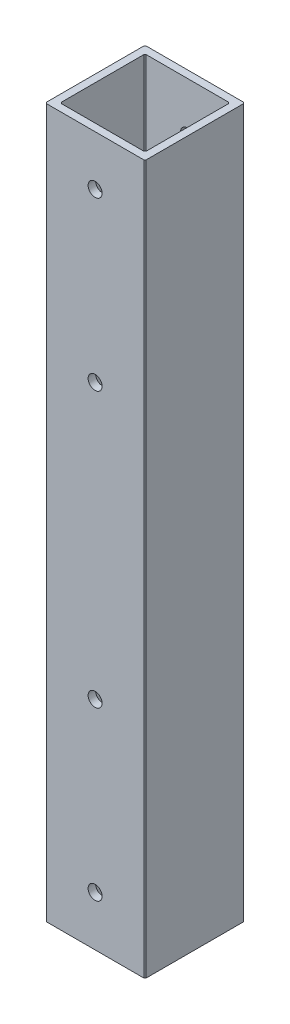
ISO-10303-21;
HEADER;
FILE_DESCRIPTION(('STEP AP214'),'2;1');
FILE_NAME('part.step','',(''),(''),'','','');
FILE_SCHEMA(('AUTOMOTIVE_DESIGN { 1 0 10303 214 1 1 1 1 }'));
ENDSEC;
DATA;
#1=APPLICATION_CONTEXT('core data for automotive mechanical design processes');
#2=APPLICATION_PROTOCOL_DEFINITION('international standard','automotive_design',2000,#1);
#3=PRODUCT_CONTEXT('',#1,'mechanical');
#4=PRODUCT('Part','Part','',(#3));
#5=PRODUCT_RELATED_PRODUCT_CATEGORY('part','',(#4));
#6=PRODUCT_DEFINITION_FORMATION('','',#4);
#7=PRODUCT_DEFINITION_CONTEXT('part definition',#1,'design');
#8=PRODUCT_DEFINITION('design','',#6,#7);
#9=PRODUCT_DEFINITION_SHAPE('','',#8);
#10=(LENGTH_UNIT() NAMED_UNIT(*) SI_UNIT(.MILLI.,.METRE.));
#11=(NAMED_UNIT(*) PLANE_ANGLE_UNIT() SI_UNIT($,.RADIAN.));
#12=(NAMED_UNIT(*) SI_UNIT($,.STERADIAN.) SOLID_ANGLE_UNIT());
#13=UNCERTAINTY_MEASURE_WITH_UNIT(LENGTH_MEASURE(1.E-05),#10,'distance_accuracy_value','');
#14=(GEOMETRIC_REPRESENTATION_CONTEXT(3) GLOBAL_UNCERTAINTY_ASSIGNED_CONTEXT((#13)) GLOBAL_UNIT_ASSIGNED_CONTEXT((#10,
#11,#12)) REPRESENTATION_CONTEXT('',''));
#15=CARTESIAN_POINT('',(0.,0.,0.));
#16=DIRECTION('',(0.,0.,1.));
#17=DIRECTION('',(1.,0.,0.));
#18=AXIS2_PLACEMENT_3D('',#15,#16,#17);
#19=CARTESIAN_POINT('',(-170.,-142.,180.));
#20=DIRECTION('',(0.,0.,1.));
#21=DIRECTION('',(1.,0.,0.));
#22=AXIS2_PLACEMENT_3D('',#19,#20,#21);
#23=PLANE('',#22);
#24=CARTESIAN_POINT('',(-190.,122.,180.));
#25=DIRECTION('',(0.,0.,-1.));
#26=DIRECTION('',(-1.,0.,0.));
#27=AXIS2_PLACEMENT_3D('',#24,#25,#26);
#28=CIRCLE('',#27,2.8);
#29=CARTESIAN_POINT('',(-192.8,122.,180.));
#30=VERTEX_POINT('',#29);
#31=EDGE_CURVE('E530',#30,#30,#28,.T.);
#32=ORIENTED_EDGE('',*,*,#31,.T.);
#33=EDGE_LOOP('',(#32));
#34=FACE_BOUND('',#33,.T.);
#35=CARTESIAN_POINT('',(-190.,55.,180.));
#36=DIRECTION('',(0.,0.,-1.));
#37=DIRECTION('',(-1.,0.,0.));
#38=AXIS2_PLACEMENT_3D('',#35,#36,#37);
#39=CIRCLE('',#38,2.8);
#40=CARTESIAN_POINT('',(-192.8,55.,180.));
#41=VERTEX_POINT('',#40);
#42=EDGE_CURVE('E522',#41,#41,#39,.T.);
#43=ORIENTED_EDGE('',*,*,#42,.T.);
#44=EDGE_LOOP('',(#43));
#45=FACE_BOUND('',#44,.T.);
#46=CARTESIAN_POINT('',(-190.,-55.,180.));
#47=DIRECTION('',(0.,0.,-1.));
#48=DIRECTION('',(-1.,0.,0.));
#49=AXIS2_PLACEMENT_3D('',#46,#47,#48);
#50=CIRCLE('',#49,2.8);
#51=CARTESIAN_POINT('',(-192.8,-55.,180.));
#52=VERTEX_POINT('',#51);
#53=EDGE_CURVE('E514',#52,#52,#50,.T.);
#54=ORIENTED_EDGE('',*,*,#53,.T.);
#55=EDGE_LOOP('',(#54));
#56=FACE_BOUND('',#55,.T.);
#57=CARTESIAN_POINT('',(-190.,-122.,180.));
#58=DIRECTION('',(0.,0.,-1.));
#59=DIRECTION('',(-1.,0.,0.));
#60=AXIS2_PLACEMENT_3D('',#57,#58,#59);
#61=CIRCLE('',#60,2.8);
#62=CARTESIAN_POINT('',(-192.8,-122.,180.));
#63=VERTEX_POINT('',#62);
#64=EDGE_CURVE('E506',#63,#63,#61,.T.);
#65=ORIENTED_EDGE('',*,*,#64,.T.);
#66=EDGE_LOOP('',(#65));
#67=FACE_BOUND('',#66,.T.);
#68=DIRECTION('',(-1.,0.,0.));
#69=VECTOR('',#68,1.);
#70=CARTESIAN_POINT('',(-170.,142.,180.));
#71=LINE('',#70,#69);
#72=CARTESIAN_POINT('',(-170.5,142.,180.));
#73=VERTEX_POINT('',#72);
#74=CARTESIAN_POINT('',(-209.5,142.,180.));
#75=VERTEX_POINT('',#74);
#76=EDGE_CURVE('E185',#73,#75,#71,.T.);
#77=ORIENTED_EDGE('',*,*,#76,.T.);
#78=DIRECTION('',(0.,-1.,0.));
#79=VECTOR('',#78,1.);
#80=CARTESIAN_POINT('',(-209.5,-142.,180.));
#81=LINE('',#80,#79);
#82=CARTESIAN_POINT('',(-209.5,-142.,180.));
#83=VERTEX_POINT('',#82);
#84=EDGE_CURVE('E229',#75,#83,#81,.T.);
#85=ORIENTED_EDGE('',*,*,#84,.T.);
#86=DIRECTION('',(-1.,0.,0.));
#87=VECTOR('',#86,1.);
#88=CARTESIAN_POINT('',(-170.,-142.,180.));
#89=LINE('',#88,#87);
#90=CARTESIAN_POINT('',(-170.5,-142.,180.));
#91=VERTEX_POINT('',#90);
#92=EDGE_CURVE('E196',#91,#83,#89,.T.);
#93=ORIENTED_EDGE('',*,*,#92,.F.);
#94=DIRECTION('',(0.,1.,0.));
#95=VECTOR('',#94,1.);
#96=CARTESIAN_POINT('',(-170.5,142.,180.));
#97=LINE('',#96,#95);
#98=EDGE_CURVE('E226',#91,#73,#97,.T.);
#99=ORIENTED_EDGE('',*,*,#98,.T.);
#100=EDGE_LOOP('',(#77,#85,#93,#99));
#101=FACE_BOUND('',#100,.T.);
#102=ADVANCED_FACE('F45',(#34,#45,#56,#67,#101),#23,.T.);
#103=CARTESIAN_POINT('',(-170.,-142.,140.));
#104=DIRECTION('',(0.,-1.,0.));
#105=DIRECTION('',(1.,0.,0.));
#106=AXIS2_PLACEMENT_3D('',#103,#104,#105);
#107=PLANE('',#106);
#108=DIRECTION('',(1.,0.,0.));
#109=VECTOR('',#108,1.);
#110=CARTESIAN_POINT('',(-207.,-142.,143.));
#111=LINE('',#110,#109);
#112=CARTESIAN_POINT('',(-206.5,-142.,143.));
#113=VERTEX_POINT('',#112);
#114=CARTESIAN_POINT('',(-173.5,-142.,143.));
#115=VERTEX_POINT('',#114);
#116=EDGE_CURVE('E286',#113,#115,#111,.T.);
#117=ORIENTED_EDGE('',*,*,#116,.F.);
#118=DIRECTION('',(0.707106781186548,0.,-0.707106781186548));
#119=VECTOR('',#118,1.);
#120=CARTESIAN_POINT('',(-206.5,-142.,143.));
#121=LINE('',#120,#119);
#122=CARTESIAN_POINT('',(-207.,-142.,143.5));
#123=VERTEX_POINT('',#122);
#124=EDGE_CURVE('E55',#113,#123,#121,.F.);
#125=ORIENTED_EDGE('',*,*,#124,.T.);
#126=DIRECTION('',(0.,0.,-1.));
#127=VECTOR('',#126,1.);
#128=CARTESIAN_POINT('',(-207.,-142.,177.));
#129=LINE('',#128,#127);
#130=CARTESIAN_POINT('',(-207.,-142.,176.5));
#131=VERTEX_POINT('',#130);
#132=EDGE_CURVE('E284',#131,#123,#129,.T.);
#133=ORIENTED_EDGE('',*,*,#132,.F.);
#134=DIRECTION('',(-0.707106781186548,0.,-0.707106781186548));
#135=VECTOR('',#134,1.);
#136=CARTESIAN_POINT('',(-207.,-142.,176.5));
#137=LINE('',#136,#135);
#138=CARTESIAN_POINT('',(-206.5,-142.,177.));
#139=VERTEX_POINT('',#138);
#140=EDGE_CURVE('E260',#131,#139,#137,.F.);
#141=ORIENTED_EDGE('',*,*,#140,.T.);
#142=DIRECTION('',(-1.,0.,0.));
#143=VECTOR('',#142,1.);
#144=CARTESIAN_POINT('',(-173.,-142.,177.));
#145=LINE('',#144,#143);
#146=CARTESIAN_POINT('',(-173.5,-142.,177.));
#147=VERTEX_POINT('',#146);
#148=EDGE_CURVE('E297',#147,#139,#145,.T.);
#149=ORIENTED_EDGE('',*,*,#148,.F.);
#150=DIRECTION('',(-0.707106781186548,0.,0.707106781186548));
#151=VECTOR('',#150,1.);
#152=CARTESIAN_POINT('',(-173.5,-142.,177.));
#153=LINE('',#152,#151);
#154=CARTESIAN_POINT('',(-173.,-142.,176.5));
#155=VERTEX_POINT('',#154);
#156=EDGE_CURVE('E272',#147,#155,#153,.F.);
#157=ORIENTED_EDGE('',*,*,#156,.T.);
#158=DIRECTION('',(0.,0.,1.));
#159=VECTOR('',#158,1.);
#160=CARTESIAN_POINT('',(-173.,-142.,143.));
#161=LINE('',#160,#159);
#162=CARTESIAN_POINT('',(-173.,-142.,143.5));
#163=VERTEX_POINT('',#162);
#164=EDGE_CURVE('E327',#163,#155,#161,.T.);
#165=ORIENTED_EDGE('',*,*,#164,.F.);
#166=DIRECTION('',(0.707106781186548,0.,0.707106781186548));
#167=VECTOR('',#166,1.);
#168=CARTESIAN_POINT('',(-173.,-142.,143.5));
#169=LINE('',#168,#167);
#170=EDGE_CURVE('E266',#163,#115,#169,.F.);
#171=ORIENTED_EDGE('',*,*,#170,.T.);
#172=EDGE_LOOP('',(#117,#125,#133,#141,#149,#157,#165,#171));
#173=FACE_BOUND('',#172,.T.);
#174=DIRECTION('',(-1.,0.,0.));
#175=VECTOR('',#174,1.);
#176=CARTESIAN_POINT('',(-170.,-142.,140.));
#177=LINE('',#176,#175);
#178=CARTESIAN_POINT('',(-170.5,-142.,140.));
#179=VERTEX_POINT('',#178);
#180=CARTESIAN_POINT('',(-209.5,-142.,140.));
#181=VERTEX_POINT('',#180);
#182=EDGE_CURVE('E184',#179,#181,#177,.T.);
#183=ORIENTED_EDGE('',*,*,#182,.F.);
#184=DIRECTION('',(0.707106781186548,0.,0.707106781186548));
#185=VECTOR('',#184,1.);
#186=CARTESIAN_POINT('',(-170.25,-142.,140.25));
#187=LINE('',#186,#185);
#188=CARTESIAN_POINT('',(-170.,-142.,140.5));
#189=VERTEX_POINT('',#188);
#190=EDGE_CURVE('E188',#179,#189,#187,.T.);
#191=ORIENTED_EDGE('',*,*,#190,.T.);
#192=DIRECTION('',(0.,0.,1.));
#193=VECTOR('',#192,1.);
#194=CARTESIAN_POINT('',(-170.,-142.,140.));
#195=LINE('',#194,#193);
#196=CARTESIAN_POINT('',(-170.,-142.,179.5));
#197=VERTEX_POINT('',#196);
#198=EDGE_CURVE('E336',#189,#197,#195,.T.);
#199=ORIENTED_EDGE('',*,*,#198,.T.);
#200=DIRECTION('',(-0.707106781186548,0.,0.707106781186548));
#201=VECTOR('',#200,1.);
#202=CARTESIAN_POINT('',(-150.25,-142.,159.75));
#203=LINE('',#202,#201);
#204=EDGE_CURVE('E190',#197,#91,#203,.T.);
#205=ORIENTED_EDGE('',*,*,#204,.T.);
#206=ORIENTED_EDGE('',*,*,#92,.T.);
#207=DIRECTION('',(0.707106781186548,0.,0.707106781186548));
#208=VECTOR('',#207,1.);
#209=CARTESIAN_POINT('',(-209.75,-142.,179.75));
#210=LINE('',#209,#208);
#211=CARTESIAN_POINT('',(-210.,-142.,179.5));
#212=VERTEX_POINT('',#211);
#213=EDGE_CURVE('E194',#83,#212,#210,.F.);
#214=ORIENTED_EDGE('',*,*,#213,.T.);
#215=DIRECTION('',(0.,0.,1.));
#216=VECTOR('',#215,1.);
#217=CARTESIAN_POINT('',(-210.,-142.,140.));
#218=LINE('',#217,#216);
#219=CARTESIAN_POINT('',(-210.,-142.,140.5));
#220=VERTEX_POINT('',#219);
#221=EDGE_CURVE('E337',#220,#212,#218,.T.);
#222=ORIENTED_EDGE('',*,*,#221,.F.);
#223=DIRECTION('',(-0.707106781186548,0.,0.707106781186548));
#224=VECTOR('',#223,1.);
#225=CARTESIAN_POINT('',(-189.75,-142.,120.25));
#226=LINE('',#225,#224);
#227=EDGE_CURVE('E202',#220,#181,#226,.F.);
#228=ORIENTED_EDGE('',*,*,#227,.T.);
#229=EDGE_LOOP('',(#183,#191,#199,#205,#206,#214,#222,#228));
#230=FACE_BOUND('',#229,.T.);
#231=ADVANCED_FACE('F282',(#173,#230),#107,.T.);
#232=CARTESIAN_POINT('',(-170.,142.,140.));
#233=DIRECTION('',(0.,0.,-1.));
#234=DIRECTION('',(-1.,0.,0.));
#235=AXIS2_PLACEMENT_3D('',#232,#233,#234);
#236=PLANE('',#235);
#237=CARTESIAN_POINT('',(-190.,122.,140.));
#238=DIRECTION('',(0.,0.,-1.));
#239=DIRECTION('',(-1.,0.,0.));
#240=AXIS2_PLACEMENT_3D('',#237,#238,#239);
#241=CIRCLE('',#240,2.8);
#242=CARTESIAN_POINT('',(-192.8,122.,140.));
#243=VERTEX_POINT('',#242);
#244=EDGE_CURVE('E471',#243,#243,#241,.T.);
#245=ORIENTED_EDGE('',*,*,#244,.F.);
#246=EDGE_LOOP('',(#245));
#247=FACE_BOUND('',#246,.T.);
#248=CARTESIAN_POINT('',(-190.,55.,140.));
#249=DIRECTION('',(0.,0.,-1.));
#250=DIRECTION('',(-1.,0.,0.));
#251=AXIS2_PLACEMENT_3D('',#248,#249,#250);
#252=CIRCLE('',#251,2.8);
#253=CARTESIAN_POINT('',(-192.8,55.,140.));
#254=VERTEX_POINT('',#253);
#255=EDGE_CURVE('E475',#254,#254,#252,.T.);
#256=ORIENTED_EDGE('',*,*,#255,.F.);
#257=EDGE_LOOP('',(#256));
#258=FACE_BOUND('',#257,.T.);
#259=CARTESIAN_POINT('',(-190.,-55.,140.));
#260=DIRECTION('',(0.,0.,-1.));
#261=DIRECTION('',(-1.,0.,0.));
#262=AXIS2_PLACEMENT_3D('',#259,#260,#261);
#263=CIRCLE('',#262,2.8);
#264=CARTESIAN_POINT('',(-192.8,-55.,140.));
#265=VERTEX_POINT('',#264);
#266=EDGE_CURVE('E479',#265,#265,#263,.T.);
#267=ORIENTED_EDGE('',*,*,#266,.F.);
#268=EDGE_LOOP('',(#267));
#269=FACE_BOUND('',#268,.T.);
#270=CARTESIAN_POINT('',(-190.,-122.,140.));
#271=DIRECTION('',(0.,0.,-1.));
#272=DIRECTION('',(-1.,0.,0.));
#273=AXIS2_PLACEMENT_3D('',#270,#271,#272);
#274=CIRCLE('',#273,2.8);
#275=CARTESIAN_POINT('',(-192.8,-122.,140.));
#276=VERTEX_POINT('',#275);
#277=EDGE_CURVE('E482',#276,#276,#274,.T.);
#278=ORIENTED_EDGE('',*,*,#277,.F.);
#279=EDGE_LOOP('',(#278));
#280=FACE_BOUND('',#279,.T.);
#281=DIRECTION('',(-1.,0.,0.));
#282=VECTOR('',#281,1.);
#283=CARTESIAN_POINT('',(-170.,142.,140.));
#284=LINE('',#283,#282);
#285=CARTESIAN_POINT('',(-170.5,142.,140.));
#286=VERTEX_POINT('',#285);
#287=CARTESIAN_POINT('',(-209.5,142.,140.));
#288=VERTEX_POINT('',#287);
#289=EDGE_CURVE('E164',#286,#288,#284,.T.);
#290=ORIENTED_EDGE('',*,*,#289,.F.);
#291=DIRECTION('',(0.,-1.,0.));
#292=VECTOR('',#291,1.);
#293=CARTESIAN_POINT('',(-170.5,-142.,140.));
#294=LINE('',#293,#292);
#295=EDGE_CURVE('E179',#286,#179,#294,.T.);
#296=ORIENTED_EDGE('',*,*,#295,.T.);
#297=ORIENTED_EDGE('',*,*,#182,.T.);
#298=DIRECTION('',(0.,1.,0.));
#299=VECTOR('',#298,1.);
#300=CARTESIAN_POINT('',(-209.5,142.,140.));
#301=LINE('',#300,#299);
#302=EDGE_CURVE('E182',#181,#288,#301,.T.);
#303=ORIENTED_EDGE('',*,*,#302,.T.);
#304=EDGE_LOOP('',(#290,#296,#297,#303));
#305=FACE_BOUND('',#304,.T.);
#306=ADVANCED_FACE('F177',(#247,#258,#269,#280,#305),#236,.T.);
#307=CARTESIAN_POINT('',(-170.,142.,180.));
#308=DIRECTION('',(0.,1.,0.));
#309=DIRECTION('',(-1.,0.,0.));
#310=AXIS2_PLACEMENT_3D('',#307,#308,#309);
#311=PLANE('',#310);
#312=DIRECTION('',(0.,0.,-1.));
#313=VECTOR('',#312,1.);
#314=CARTESIAN_POINT('',(-207.,142.,177.));
#315=LINE('',#314,#313);
#316=CARTESIAN_POINT('',(-207.,142.,176.5));
#317=VERTEX_POINT('',#316);
#318=CARTESIAN_POINT('',(-207.,142.,143.5));
#319=VERTEX_POINT('',#318);
#320=EDGE_CURVE('E304',#317,#319,#315,.T.);
#321=ORIENTED_EDGE('',*,*,#320,.T.);
#322=DIRECTION('',(-0.707106781186548,0.,0.707106781186548));
#323=VECTOR('',#322,1.);
#324=CARTESIAN_POINT('',(-206.5,142.,143.));
#325=LINE('',#324,#323);
#326=CARTESIAN_POINT('',(-206.5,142.,143.));
#327=VERTEX_POINT('',#326);
#328=EDGE_CURVE('E11',#319,#327,#325,.F.);
#329=ORIENTED_EDGE('',*,*,#328,.T.);
#330=DIRECTION('',(1.,0.,0.));
#331=VECTOR('',#330,1.);
#332=CARTESIAN_POINT('',(-207.,142.,143.));
#333=LINE('',#332,#331);
#334=CARTESIAN_POINT('',(-173.5,142.,143.));
#335=VERTEX_POINT('',#334);
#336=EDGE_CURVE('E296',#327,#335,#333,.T.);
#337=ORIENTED_EDGE('',*,*,#336,.T.);
#338=DIRECTION('',(-0.707106781186548,0.,-0.707106781186548));
#339=VECTOR('',#338,1.);
#340=CARTESIAN_POINT('',(-173.,142.,143.5));
#341=LINE('',#340,#339);
#342=CARTESIAN_POINT('',(-173.,142.,143.5));
#343=VERTEX_POINT('',#342);
#344=EDGE_CURVE('E269',#335,#343,#341,.F.);
#345=ORIENTED_EDGE('',*,*,#344,.T.);
#346=DIRECTION('',(0.,0.,1.));
#347=VECTOR('',#346,1.);
#348=CARTESIAN_POINT('',(-173.,142.,143.));
#349=LINE('',#348,#347);
#350=CARTESIAN_POINT('',(-173.,142.,176.5));
#351=VERTEX_POINT('',#350);
#352=EDGE_CURVE('E309',#343,#351,#349,.T.);
#353=ORIENTED_EDGE('',*,*,#352,.T.);
#354=DIRECTION('',(0.707106781186548,0.,-0.707106781186548));
#355=VECTOR('',#354,1.);
#356=CARTESIAN_POINT('',(-173.5,142.,177.));
#357=LINE('',#356,#355);
#358=CARTESIAN_POINT('',(-173.5,142.,177.));
#359=VERTEX_POINT('',#358);
#360=EDGE_CURVE('E275',#351,#359,#357,.F.);
#361=ORIENTED_EDGE('',*,*,#360,.T.);
#362=DIRECTION('',(-1.,0.,0.));
#363=VECTOR('',#362,1.);
#364=CARTESIAN_POINT('',(-173.,142.,177.));
#365=LINE('',#364,#363);
#366=CARTESIAN_POINT('',(-206.5,142.,177.));
#367=VERTEX_POINT('',#366);
#368=EDGE_CURVE('E313',#359,#367,#365,.T.);
#369=ORIENTED_EDGE('',*,*,#368,.T.);
#370=DIRECTION('',(0.707106781186548,0.,0.707106781186548));
#371=VECTOR('',#370,1.);
#372=CARTESIAN_POINT('',(-207.,142.,176.5));
#373=LINE('',#372,#371);
#374=EDGE_CURVE('E263',#367,#317,#373,.F.);
#375=ORIENTED_EDGE('',*,*,#374,.T.);
#376=EDGE_LOOP('',(#321,#329,#337,#345,#353,#361,#369,#375));
#377=FACE_BOUND('',#376,.T.);
#378=DIRECTION('',(0.,0.,-1.));
#379=VECTOR('',#378,1.);
#380=CARTESIAN_POINT('',(-170.,142.,180.));
#381=LINE('',#380,#379);
#382=CARTESIAN_POINT('',(-170.,142.,179.5));
#383=VERTEX_POINT('',#382);
#384=CARTESIAN_POINT('',(-170.,142.,140.5));
#385=VERTEX_POINT('',#384);
#386=EDGE_CURVE('E167',#383,#385,#381,.T.);
#387=ORIENTED_EDGE('',*,*,#386,.T.);
#388=DIRECTION('',(-0.707106781186548,0.,-0.707106781186548));
#389=VECTOR('',#388,1.);
#390=CARTESIAN_POINT('',(-150.25,142.,160.25));
#391=LINE('',#390,#389);
#392=EDGE_CURVE('E161',#385,#286,#391,.T.);
#393=ORIENTED_EDGE('',*,*,#392,.T.);
#394=ORIENTED_EDGE('',*,*,#289,.T.);
#395=DIRECTION('',(0.707106781186548,0.,-0.707106781186548));
#396=VECTOR('',#395,1.);
#397=CARTESIAN_POINT('',(-209.75,142.,140.25));
#398=LINE('',#397,#396);
#399=CARTESIAN_POINT('',(-210.,142.,140.5));
#400=VERTEX_POINT('',#399);
#401=EDGE_CURVE('E173',#288,#400,#398,.F.);
#402=ORIENTED_EDGE('',*,*,#401,.T.);
#403=DIRECTION('',(0.,0.,-1.));
#404=VECTOR('',#403,1.);
#405=CARTESIAN_POINT('',(-210.,142.,180.));
#406=LINE('',#405,#404);
#407=CARTESIAN_POINT('',(-210.,142.,179.5));
#408=VERTEX_POINT('',#407);
#409=EDGE_CURVE('E324',#408,#400,#406,.T.);
#410=ORIENTED_EDGE('',*,*,#409,.F.);
#411=DIRECTION('',(-0.707106781186548,0.,-0.707106781186548));
#412=VECTOR('',#411,1.);
#413=CARTESIAN_POINT('',(-189.75,142.,199.75));
#414=LINE('',#413,#412);
#415=EDGE_CURVE('E62',#408,#75,#414,.F.);
#416=ORIENTED_EDGE('',*,*,#415,.T.);
#417=ORIENTED_EDGE('',*,*,#76,.F.);
#418=DIRECTION('',(0.707106781186548,0.,-0.707106781186548));
#419=VECTOR('',#418,1.);
#420=CARTESIAN_POINT('',(-170.25,142.,179.75));
#421=LINE('',#420,#419);
#422=EDGE_CURVE('E70',#73,#383,#421,.T.);
#423=ORIENTED_EDGE('',*,*,#422,.T.);
#424=EDGE_LOOP('',(#387,#393,#394,#402,#410,#416,#417,#423));
#425=FACE_BOUND('',#424,.T.);
#426=ADVANCED_FACE('F163',(#377,#425),#311,.T.);
#427=CARTESIAN_POINT('',(-170.,0.,0.));
#428=DIRECTION('',(-1.,0.,0.));
#429=DIRECTION('',(0.,-1.,0.));
#430=AXIS2_PLACEMENT_3D('',#427,#428,#429);
#431=PLANE('',#430);
#432=ORIENTED_EDGE('',*,*,#198,.F.);
#433=DIRECTION('',(0.,1.,0.));
#434=VECTOR('',#433,1.);
#435=CARTESIAN_POINT('',(-170.,142.,140.5));
#436=LINE('',#435,#434);
#437=EDGE_CURVE('E210',#189,#385,#436,.T.);
#438=ORIENTED_EDGE('',*,*,#437,.T.);
#439=ORIENTED_EDGE('',*,*,#386,.F.);
#440=DIRECTION('',(0.,-1.,0.));
#441=VECTOR('',#440,1.);
#442=CARTESIAN_POINT('',(-170.,-142.,179.5));
#443=LINE('',#442,#441);
#444=EDGE_CURVE('E207',#383,#197,#443,.T.);
#445=ORIENTED_EDGE('',*,*,#444,.T.);
#446=EDGE_LOOP('',(#432,#438,#439,#445));
#447=FACE_BOUND('',#446,.T.);
#448=ADVANCED_FACE('F368',(#447),#431,.F.);
#449=CARTESIAN_POINT('',(-210.,0.,0.));
#450=DIRECTION('',(-1.,0.,0.));
#451=DIRECTION('',(0.,-1.,0.));
#452=AXIS2_PLACEMENT_3D('',#449,#450,#451);
#453=PLANE('',#452);
#454=ORIENTED_EDGE('',*,*,#409,.T.);
#455=DIRECTION('',(0.,-1.,0.));
#456=VECTOR('',#455,1.);
#457=CARTESIAN_POINT('',(-210.,0.,140.5));
#458=LINE('',#457,#456);
#459=EDGE_CURVE('E222',#400,#220,#458,.T.);
#460=ORIENTED_EDGE('',*,*,#459,.T.);
#461=ORIENTED_EDGE('',*,*,#221,.T.);
#462=DIRECTION('',(0.,1.,0.));
#463=VECTOR('',#462,1.);
#464=CARTESIAN_POINT('',(-210.,0.,179.5));
#465=LINE('',#464,#463);
#466=EDGE_CURVE('E172',#212,#408,#465,.T.);
#467=ORIENTED_EDGE('',*,*,#466,.T.);
#468=EDGE_LOOP('',(#454,#460,#461,#467));
#469=FACE_BOUND('',#468,.T.);
#470=ADVANCED_FACE('F361',(#469),#453,.T.);
#471=CARTESIAN_POINT('',(-207.,142.,143.));
#472=DIRECTION('',(0.,0.,-1.));
#473=DIRECTION('',(-1.,0.,0.));
#474=AXIS2_PLACEMENT_3D('',#471,#472,#473);
#475=PLANE('',#474);
#476=CARTESIAN_POINT('',(-190.,122.,143.));
#477=DIRECTION('',(0.,0.,-1.));
#478=DIRECTION('',(-1.,0.,0.));
#479=AXIS2_PLACEMENT_3D('',#476,#477,#478);
#480=CIRCLE('',#479,2.8);
#481=CARTESIAN_POINT('',(-192.8,122.,143.));
#482=VERTEX_POINT('',#481);
#483=EDGE_CURVE('E500',#482,#482,#480,.T.);
#484=ORIENTED_EDGE('',*,*,#483,.T.);
#485=EDGE_LOOP('',(#484));
#486=FACE_BOUND('',#485,.T.);
#487=CARTESIAN_POINT('',(-190.,55.,143.));
#488=DIRECTION('',(0.,0.,-1.));
#489=DIRECTION('',(-1.,0.,0.));
#490=AXIS2_PLACEMENT_3D('',#487,#488,#489);
#491=CIRCLE('',#490,2.8);
#492=CARTESIAN_POINT('',(-192.8,55.,143.));
#493=VERTEX_POINT('',#492);
#494=EDGE_CURVE('E494',#493,#493,#491,.T.);
#495=ORIENTED_EDGE('',*,*,#494,.T.);
#496=EDGE_LOOP('',(#495));
#497=FACE_BOUND('',#496,.T.);
#498=CARTESIAN_POINT('',(-190.,-55.,143.));
#499=DIRECTION('',(0.,0.,-1.));
#500=DIRECTION('',(-1.,0.,0.));
#501=AXIS2_PLACEMENT_3D('',#498,#499,#500);
#502=CIRCLE('',#501,2.8);
#503=CARTESIAN_POINT('',(-192.8,-55.,143.));
#504=VERTEX_POINT('',#503);
#505=EDGE_CURVE('E485',#504,#504,#502,.T.);
#506=ORIENTED_EDGE('',*,*,#505,.T.);
#507=EDGE_LOOP('',(#506));
#508=FACE_BOUND('',#507,.T.);
#509=CARTESIAN_POINT('',(-190.,-122.,143.));
#510=DIRECTION('',(0.,0.,-1.));
#511=DIRECTION('',(-1.,0.,0.));
#512=AXIS2_PLACEMENT_3D('',#509,#510,#511);
#513=CIRCLE('',#512,2.8);
#514=CARTESIAN_POINT('',(-192.8,-122.,143.));
#515=VERTEX_POINT('',#514);
#516=EDGE_CURVE('E316',#515,#515,#513,.T.);
#517=ORIENTED_EDGE('',*,*,#516,.T.);
#518=EDGE_LOOP('',(#517));
#519=FACE_BOUND('',#518,.T.);
#520=ORIENTED_EDGE('',*,*,#116,.T.);
#521=DIRECTION('',(0.,1.,0.));
#522=VECTOR('',#521,1.);
#523=CARTESIAN_POINT('',(-173.5,142.,143.));
#524=LINE('',#523,#522);
#525=EDGE_CURVE('E257',#115,#335,#524,.T.);
#526=ORIENTED_EDGE('',*,*,#525,.T.);
#527=ORIENTED_EDGE('',*,*,#336,.F.);
#528=DIRECTION('',(0.,-1.,0.));
#529=VECTOR('',#528,1.);
#530=CARTESIAN_POINT('',(-206.5,-142.,143.));
#531=LINE('',#530,#529);
#532=EDGE_CURVE('E253',#327,#113,#531,.T.);
#533=ORIENTED_EDGE('',*,*,#532,.T.);
#534=EDGE_LOOP('',(#520,#526,#527,#533));
#535=FACE_BOUND('',#534,.T.);
#536=ADVANCED_FACE('F306',(#486,#497,#508,#519,#535),#475,.F.);
#537=CARTESIAN_POINT('',(-207.,142.,177.));
#538=DIRECTION('',(-1.,0.,0.));
#539=DIRECTION('',(0.,-1.,0.));
#540=AXIS2_PLACEMENT_3D('',#537,#538,#539);
#541=PLANE('',#540);
#542=ORIENTED_EDGE('',*,*,#320,.F.);
#543=DIRECTION('',(0.,-1.,0.));
#544=VECTOR('',#543,1.);
#545=CARTESIAN_POINT('',(-207.,-142.,176.5));
#546=LINE('',#545,#544);
#547=EDGE_CURVE('E235',#317,#131,#546,.T.);
#548=ORIENTED_EDGE('',*,*,#547,.T.);
#549=ORIENTED_EDGE('',*,*,#132,.T.);
#550=DIRECTION('',(0.,1.,0.));
#551=VECTOR('',#550,1.);
#552=CARTESIAN_POINT('',(-207.,142.,143.5));
#553=LINE('',#552,#551);
#554=EDGE_CURVE('E232',#123,#319,#553,.T.);
#555=ORIENTED_EDGE('',*,*,#554,.T.);
#556=EDGE_LOOP('',(#542,#548,#549,#555));
#557=FACE_BOUND('',#556,.T.);
#558=ADVANCED_FACE('F292',(#557),#541,.F.);
#559=CARTESIAN_POINT('',(-173.,142.,177.));
#560=DIRECTION('',(0.,0.,1.));
#561=DIRECTION('',(1.,0.,0.));
#562=AXIS2_PLACEMENT_3D('',#559,#560,#561);
#563=PLANE('',#562);
#564=CARTESIAN_POINT('',(-190.,122.,177.));
#565=DIRECTION('',(0.,0.,-1.));
#566=DIRECTION('',(-1.,0.,0.));
#567=AXIS2_PLACEMENT_3D('',#564,#565,#566);
#568=CIRCLE('',#567,2.8);
#569=CARTESIAN_POINT('',(-192.8,122.,177.));
#570=VERTEX_POINT('',#569);
#571=EDGE_CURVE('E533',#570,#570,#568,.T.);
#572=ORIENTED_EDGE('',*,*,#571,.F.);
#573=EDGE_LOOP('',(#572));
#574=FACE_BOUND('',#573,.T.);
#575=CARTESIAN_POINT('',(-190.,55.,177.));
#576=DIRECTION('',(0.,0.,-1.));
#577=DIRECTION('',(-1.,0.,0.));
#578=AXIS2_PLACEMENT_3D('',#575,#576,#577);
#579=CIRCLE('',#578,2.8);
#580=CARTESIAN_POINT('',(-192.8,55.,177.));
#581=VERTEX_POINT('',#580);
#582=EDGE_CURVE('E526',#581,#581,#579,.T.);
#583=ORIENTED_EDGE('',*,*,#582,.F.);
#584=EDGE_LOOP('',(#583));
#585=FACE_BOUND('',#584,.T.);
#586=CARTESIAN_POINT('',(-190.,-55.,177.));
#587=DIRECTION('',(0.,0.,-1.));
#588=DIRECTION('',(-1.,0.,0.));
#589=AXIS2_PLACEMENT_3D('',#586,#587,#588);
#590=CIRCLE('',#589,2.8);
#591=CARTESIAN_POINT('',(-192.8,-55.,177.));
#592=VERTEX_POINT('',#591);
#593=EDGE_CURVE('E518',#592,#592,#590,.T.);
#594=ORIENTED_EDGE('',*,*,#593,.F.);
#595=EDGE_LOOP('',(#594));
#596=FACE_BOUND('',#595,.T.);
#597=CARTESIAN_POINT('',(-190.,-122.,177.));
#598=DIRECTION('',(0.,0.,-1.));
#599=DIRECTION('',(-1.,0.,0.));
#600=AXIS2_PLACEMENT_3D('',#597,#598,#599);
#601=CIRCLE('',#600,2.8);
#602=CARTESIAN_POINT('',(-192.8,-122.,177.));
#603=VERTEX_POINT('',#602);
#604=EDGE_CURVE('E510',#603,#603,#601,.T.);
#605=ORIENTED_EDGE('',*,*,#604,.F.);
#606=EDGE_LOOP('',(#605));
#607=FACE_BOUND('',#606,.T.);
#608=ORIENTED_EDGE('',*,*,#148,.T.);
#609=DIRECTION('',(0.,1.,0.));
#610=VECTOR('',#609,1.);
#611=CARTESIAN_POINT('',(-206.5,142.,177.));
#612=LINE('',#611,#610);
#613=EDGE_CURVE('E243',#139,#367,#612,.T.);
#614=ORIENTED_EDGE('',*,*,#613,.T.);
#615=ORIENTED_EDGE('',*,*,#368,.F.);
#616=DIRECTION('',(0.,-1.,0.));
#617=VECTOR('',#616,1.);
#618=CARTESIAN_POINT('',(-173.5,-142.,177.));
#619=LINE('',#618,#617);
#620=EDGE_CURVE('E239',#359,#147,#619,.T.);
#621=ORIENTED_EDGE('',*,*,#620,.T.);
#622=EDGE_LOOP('',(#608,#614,#615,#621));
#623=FACE_BOUND('',#622,.T.);
#624=ADVANCED_FACE('F436',(#574,#585,#596,#607,#623),#563,.F.);
#625=CARTESIAN_POINT('',(-173.,142.,143.));
#626=DIRECTION('',(1.,0.,0.));
#627=DIRECTION('',(0.,1.,0.));
#628=AXIS2_PLACEMENT_3D('',#625,#626,#627);
#629=PLANE('',#628);
#630=ORIENTED_EDGE('',*,*,#352,.F.);
#631=DIRECTION('',(0.,-1.,0.));
#632=VECTOR('',#631,1.);
#633=CARTESIAN_POINT('',(-173.,-142.,143.5));
#634=LINE('',#633,#632);
#635=EDGE_CURVE('E249',#343,#163,#634,.T.);
#636=ORIENTED_EDGE('',*,*,#635,.T.);
#637=ORIENTED_EDGE('',*,*,#164,.T.);
#638=DIRECTION('',(0.,1.,0.));
#639=VECTOR('',#638,1.);
#640=CARTESIAN_POINT('',(-173.,142.,176.5));
#641=LINE('',#640,#639);
#642=EDGE_CURVE('E246',#155,#351,#641,.T.);
#643=ORIENTED_EDGE('',*,*,#642,.T.);
#644=EDGE_LOOP('',(#630,#636,#637,#643));
#645=FACE_BOUND('',#644,.T.);
#646=ADVANCED_FACE('F441',(#645),#629,.F.);
#647=CARTESIAN_POINT('',(-190.,-122.,140.));
#648=DIRECTION('',(0.,0.,-1.));
#649=DIRECTION('',(-1.,0.,0.));
#650=AXIS2_PLACEMENT_3D('',#647,#648,#649);
#651=CYLINDRICAL_SURFACE('',#650,2.8);
#652=ORIENTED_EDGE('',*,*,#516,.F.);
#653=EDGE_LOOP('',(#652));
#654=FACE_BOUND('',#653,.T.);
#655=ORIENTED_EDGE('',*,*,#277,.T.);
#656=EDGE_LOOP('',(#655));
#657=FACE_BOUND('',#656,.T.);
#658=ADVANCED_FACE('F444',(#654,#657),#651,.F.);
#659=CARTESIAN_POINT('',(-190.,-55.,140.));
#660=DIRECTION('',(0.,0.,-1.));
#661=DIRECTION('',(-1.,0.,0.));
#662=AXIS2_PLACEMENT_3D('',#659,#660,#661);
#663=CYLINDRICAL_SURFACE('',#662,2.8);
#664=ORIENTED_EDGE('',*,*,#505,.F.);
#665=EDGE_LOOP('',(#664));
#666=FACE_BOUND('',#665,.T.);
#667=ORIENTED_EDGE('',*,*,#266,.T.);
#668=EDGE_LOOP('',(#667));
#669=FACE_BOUND('',#668,.T.);
#670=ADVANCED_FACE('F450',(#666,#669),#663,.F.);
#671=CARTESIAN_POINT('',(-190.,55.,140.));
#672=DIRECTION('',(0.,0.,-1.));
#673=DIRECTION('',(-1.,0.,0.));
#674=AXIS2_PLACEMENT_3D('',#671,#672,#673);
#675=CYLINDRICAL_SURFACE('',#674,2.8);
#676=ORIENTED_EDGE('',*,*,#494,.F.);
#677=EDGE_LOOP('',(#676));
#678=FACE_BOUND('',#677,.T.);
#679=ORIENTED_EDGE('',*,*,#255,.T.);
#680=EDGE_LOOP('',(#679));
#681=FACE_BOUND('',#680,.T.);
#682=ADVANCED_FACE('F558',(#678,#681),#675,.F.);
#683=CARTESIAN_POINT('',(-190.,122.,140.));
#684=DIRECTION('',(0.,0.,-1.));
#685=DIRECTION('',(-1.,0.,0.));
#686=AXIS2_PLACEMENT_3D('',#683,#684,#685);
#687=CYLINDRICAL_SURFACE('',#686,2.8);
#688=ORIENTED_EDGE('',*,*,#483,.F.);
#689=EDGE_LOOP('',(#688));
#690=FACE_BOUND('',#689,.T.);
#691=ORIENTED_EDGE('',*,*,#244,.T.);
#692=EDGE_LOOP('',(#691));
#693=FACE_BOUND('',#692,.T.);
#694=ADVANCED_FACE('F548',(#690,#693),#687,.F.);
#695=CARTESIAN_POINT('',(-190.,-122.,177.));
#696=DIRECTION('',(0.,0.,-1.));
#697=DIRECTION('',(-1.,0.,0.));
#698=AXIS2_PLACEMENT_3D('',#695,#696,#697);
#699=CYLINDRICAL_SURFACE('',#698,2.8);
#700=ORIENTED_EDGE('',*,*,#64,.F.);
#701=EDGE_LOOP('',(#700));
#702=FACE_BOUND('',#701,.T.);
#703=ORIENTED_EDGE('',*,*,#604,.T.);
#704=EDGE_LOOP('',(#703));
#705=FACE_BOUND('',#704,.T.);
#706=ADVANCED_FACE('F545',(#702,#705),#699,.F.);
#707=CARTESIAN_POINT('',(-190.,-55.,177.));
#708=DIRECTION('',(0.,0.,-1.));
#709=DIRECTION('',(-1.,0.,0.));
#710=AXIS2_PLACEMENT_3D('',#707,#708,#709);
#711=CYLINDRICAL_SURFACE('',#710,2.8);
#712=ORIENTED_EDGE('',*,*,#53,.F.);
#713=EDGE_LOOP('',(#712));
#714=FACE_BOUND('',#713,.T.);
#715=ORIENTED_EDGE('',*,*,#593,.T.);
#716=EDGE_LOOP('',(#715));
#717=FACE_BOUND('',#716,.T.);
#718=ADVANCED_FACE('F547',(#714,#717),#711,.F.);
#719=CARTESIAN_POINT('',(-190.,55.,177.));
#720=DIRECTION('',(0.,0.,-1.));
#721=DIRECTION('',(-1.,0.,0.));
#722=AXIS2_PLACEMENT_3D('',#719,#720,#721);
#723=CYLINDRICAL_SURFACE('',#722,2.8);
#724=ORIENTED_EDGE('',*,*,#42,.F.);
#725=EDGE_LOOP('',(#724));
#726=FACE_BOUND('',#725,.T.);
#727=ORIENTED_EDGE('',*,*,#582,.T.);
#728=EDGE_LOOP('',(#727));
#729=FACE_BOUND('',#728,.T.);
#730=ADVANCED_FACE('F555',(#726,#729),#723,.F.);
#731=CARTESIAN_POINT('',(-190.,122.,177.));
#732=DIRECTION('',(0.,0.,-1.));
#733=DIRECTION('',(-1.,0.,0.));
#734=AXIS2_PLACEMENT_3D('',#731,#732,#733);
#735=CYLINDRICAL_SURFACE('',#734,2.8);
#736=ORIENTED_EDGE('',*,*,#31,.F.);
#737=EDGE_LOOP('',(#736));
#738=FACE_BOUND('',#737,.T.);
#739=ORIENTED_EDGE('',*,*,#571,.T.);
#740=EDGE_LOOP('',(#739));
#741=FACE_BOUND('',#740,.T.);
#742=ADVANCED_FACE('F402',(#738,#741),#735,.F.);
#743=CARTESIAN_POINT('',(-170.5,142.,140.));
#744=DIRECTION('',(0.707106781186547,0.,-0.707106781186547));
#745=DIRECTION('',(0.,1.,0.));
#746=AXIS2_PLACEMENT_3D('',#743,#744,#745);
#747=PLANE('',#746);
#748=ORIENTED_EDGE('',*,*,#392,.F.);
#749=ORIENTED_EDGE('',*,*,#437,.F.);
#750=ORIENTED_EDGE('',*,*,#190,.F.);
#751=ORIENTED_EDGE('',*,*,#295,.F.);
#752=EDGE_LOOP('',(#748,#749,#750,#751));
#753=FACE_BOUND('',#752,.T.);
#754=ADVANCED_FACE('F187',(#753),#747,.T.);
#755=CARTESIAN_POINT('',(-210.,0.,140.5));
#756=DIRECTION('',(0.707106781186548,0.,0.707106781186548));
#757=DIRECTION('',(0.,-1.,0.));
#758=AXIS2_PLACEMENT_3D('',#755,#756,#757);
#759=PLANE('',#758);
#760=ORIENTED_EDGE('',*,*,#401,.F.);
#761=ORIENTED_EDGE('',*,*,#302,.F.);
#762=ORIENTED_EDGE('',*,*,#227,.F.);
#763=ORIENTED_EDGE('',*,*,#459,.F.);
#764=EDGE_LOOP('',(#760,#761,#762,#763));
#765=FACE_BOUND('',#764,.T.);
#766=ADVANCED_FACE('F364',(#765),#759,.F.);
#767=CARTESIAN_POINT('',(-210.,0.,179.5));
#768=DIRECTION('',(0.707106781186547,0.,-0.707106781186547));
#769=DIRECTION('',(0.,1.,0.));
#770=AXIS2_PLACEMENT_3D('',#767,#768,#769);
#771=PLANE('',#770);
#772=ORIENTED_EDGE('',*,*,#213,.F.);
#773=ORIENTED_EDGE('',*,*,#84,.F.);
#774=ORIENTED_EDGE('',*,*,#415,.F.);
#775=ORIENTED_EDGE('',*,*,#466,.F.);
#776=EDGE_LOOP('',(#772,#773,#774,#775));
#777=FACE_BOUND('',#776,.T.);
#778=ADVANCED_FACE('F357',(#777),#771,.F.);
#779=CARTESIAN_POINT('',(-207.,142.,176.5));
#780=DIRECTION('',(0.707106781186547,0.,-0.707106781186547));
#781=DIRECTION('',(0.,1.,0.));
#782=AXIS2_PLACEMENT_3D('',#779,#780,#781);
#783=PLANE('',#782);
#784=ORIENTED_EDGE('',*,*,#374,.F.);
#785=ORIENTED_EDGE('',*,*,#613,.F.);
#786=ORIENTED_EDGE('',*,*,#140,.F.);
#787=ORIENTED_EDGE('',*,*,#547,.F.);
#788=EDGE_LOOP('',(#784,#785,#786,#787));
#789=FACE_BOUND('',#788,.T.);
#790=ADVANCED_FACE('F372',(#789),#783,.T.);
#791=CARTESIAN_POINT('',(-170.5,-142.,180.));
#792=DIRECTION('',(0.707106781186548,0.,0.707106781186548));
#793=DIRECTION('',(0.,-1.,0.));
#794=AXIS2_PLACEMENT_3D('',#791,#792,#793);
#795=PLANE('',#794);
#796=ORIENTED_EDGE('',*,*,#204,.F.);
#797=ORIENTED_EDGE('',*,*,#444,.F.);
#798=ORIENTED_EDGE('',*,*,#422,.F.);
#799=ORIENTED_EDGE('',*,*,#98,.F.);
#800=EDGE_LOOP('',(#796,#797,#798,#799));
#801=FACE_BOUND('',#800,.T.);
#802=ADVANCED_FACE('F369',(#801),#795,.T.);
#803=CARTESIAN_POINT('',(-173.,142.,143.5));
#804=DIRECTION('',(-0.707106781186547,0.,0.707106781186547));
#805=DIRECTION('',(0.,1.,0.));
#806=AXIS2_PLACEMENT_3D('',#803,#804,#805);
#807=PLANE('',#806);
#808=ORIENTED_EDGE('',*,*,#344,.F.);
#809=ORIENTED_EDGE('',*,*,#525,.F.);
#810=ORIENTED_EDGE('',*,*,#170,.F.);
#811=ORIENTED_EDGE('',*,*,#635,.F.);
#812=EDGE_LOOP('',(#808,#809,#810,#811));
#813=FACE_BOUND('',#812,.T.);
#814=ADVANCED_FACE('F371',(#813),#807,.T.);
#815=CARTESIAN_POINT('',(-173.5,142.,177.));
#816=DIRECTION('',(-0.707106781186548,0.,-0.707106781186548));
#817=DIRECTION('',(0.,1.,0.));
#818=AXIS2_PLACEMENT_3D('',#815,#816,#817);
#819=PLANE('',#818);
#820=ORIENTED_EDGE('',*,*,#360,.F.);
#821=ORIENTED_EDGE('',*,*,#642,.F.);
#822=ORIENTED_EDGE('',*,*,#156,.F.);
#823=ORIENTED_EDGE('',*,*,#620,.F.);
#824=EDGE_LOOP('',(#820,#821,#822,#823));
#825=FACE_BOUND('',#824,.T.);
#826=ADVANCED_FACE('F378',(#825),#819,.T.);
#827=CARTESIAN_POINT('',(-206.5,142.,143.));
#828=DIRECTION('',(0.707106781186547,0.,0.707106781186547));
#829=DIRECTION('',(0.,1.,0.));
#830=AXIS2_PLACEMENT_3D('',#827,#828,#829);
#831=PLANE('',#830);
#832=ORIENTED_EDGE('',*,*,#328,.F.);
#833=ORIENTED_EDGE('',*,*,#554,.F.);
#834=ORIENTED_EDGE('',*,*,#124,.F.);
#835=ORIENTED_EDGE('',*,*,#532,.F.);
#836=EDGE_LOOP('',(#832,#833,#834,#835));
#837=FACE_BOUND('',#836,.T.);
#838=ADVANCED_FACE('F48',(#837),#831,.T.);
#839=CLOSED_SHELL('',(#102,#231,#306,#426,#448,#470,#536,#558,#624,#646,#658,#670,#682,#694,
#706,#718,#730,#742,#754,#766,#778,#790,#802,#814,#826,#838));
#840=MANIFOLD_SOLID_BREP('B2',#839);
#841=ADVANCED_BREP_SHAPE_REPRESENTATION('',(#18,#840),#14);
#842=SHAPE_DEFINITION_REPRESENTATION(#9,#841);
ENDSEC;
END-ISO-10303-21;
